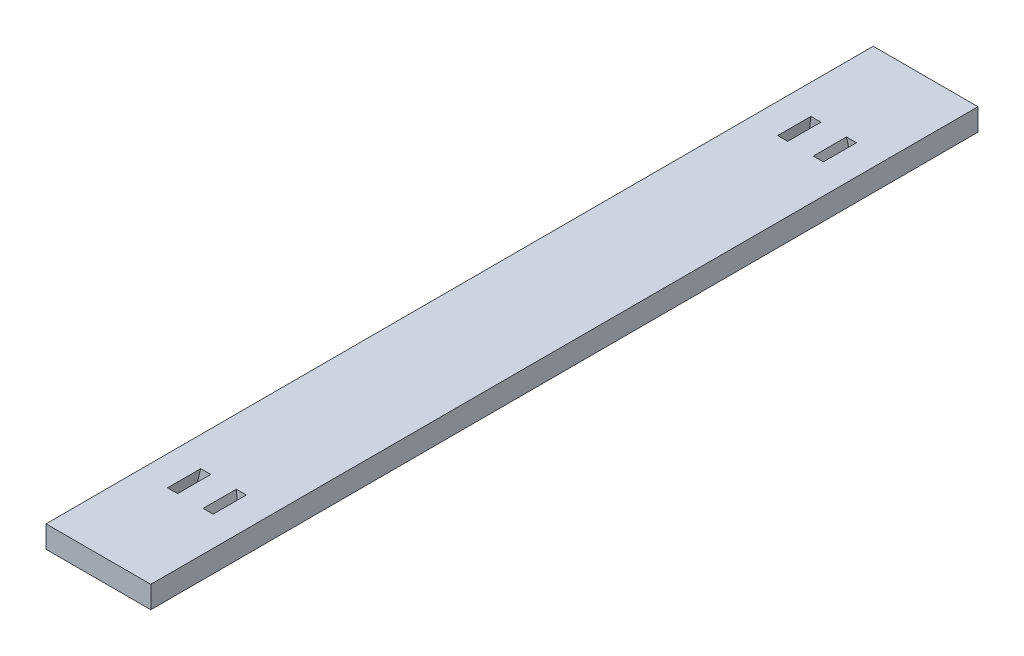
ISO-10303-21;
HEADER;
FILE_DESCRIPTION(('STEP AP214'),'2;1');
FILE_NAME('part.step','',(''),(''),'','','');
FILE_SCHEMA(('AUTOMOTIVE_DESIGN { 1 0 10303 214 1 1 1 1 }'));
ENDSEC;
DATA;
#1=APPLICATION_CONTEXT('core data for automotive mechanical design processes');
#2=APPLICATION_PROTOCOL_DEFINITION('international standard','automotive_design',2000,#1);
#3=PRODUCT_CONTEXT('',#1,'mechanical');
#4=PRODUCT('Part','Part','',(#3));
#5=PRODUCT_RELATED_PRODUCT_CATEGORY('part','',(#4));
#6=PRODUCT_DEFINITION_FORMATION('','',#4);
#7=PRODUCT_DEFINITION_CONTEXT('part definition',#1,'design');
#8=PRODUCT_DEFINITION('design','',#6,#7);
#9=PRODUCT_DEFINITION_SHAPE('','',#8);
#10=(LENGTH_UNIT() NAMED_UNIT(*) SI_UNIT(.MILLI.,.METRE.));
#11=(NAMED_UNIT(*) PLANE_ANGLE_UNIT() SI_UNIT($,.RADIAN.));
#12=(NAMED_UNIT(*) SI_UNIT($,.STERADIAN.) SOLID_ANGLE_UNIT());
#13=UNCERTAINTY_MEASURE_WITH_UNIT(LENGTH_MEASURE(1.E-05),#10,'distance_accuracy_value','');
#14=(GEOMETRIC_REPRESENTATION_CONTEXT(3) GLOBAL_UNCERTAINTY_ASSIGNED_CONTEXT((#13)) GLOBAL_UNIT_ASSIGNED_CONTEXT((#10,
#11,#12)) REPRESENTATION_CONTEXT('',''));
#15=CARTESIAN_POINT('',(0.,0.,0.));
#16=DIRECTION('',(0.,0.,1.));
#17=DIRECTION('',(1.,0.,0.));
#18=AXIS2_PLACEMENT_3D('',#15,#16,#17);
#19=CARTESIAN_POINT('',(0.,0.,-1500.));
#20=DIRECTION('',(0.,1.,0.));
#21=DIRECTION('',(0.,0.,1.));
#22=AXIS2_PLACEMENT_3D('',#19,#20,#21);
#23=PLANE('',#22);
#24=DIRECTION('',(-1.,0.,0.));
#25=VECTOR('',#24,1.);
#26=CARTESIAN_POINT('',(118.153345581463,0.,-1273.13111618982));
#27=LINE('',#26,#25);
#28=CARTESIAN_POINT('',(136.333345581463,0.,-1273.13111618982));
#29=VERTEX_POINT('',#28);
#30=CARTESIAN_POINT('',(118.153345581463,0.,-1273.13111618982));
#31=VERTEX_POINT('',#30);
#32=EDGE_CURVE('E217',#29,#31,#27,.T.);
#33=ORIENTED_EDGE('',*,*,#32,.T.);
#34=DIRECTION('',(0.,0.,-1.));
#35=VECTOR('',#34,1.);
#36=CARTESIAN_POINT('',(118.153345581463,0.,-1273.13111618982));
#37=LINE('',#36,#35);
#38=CARTESIAN_POINT('',(118.153345581463,0.,-1333.3));
#39=VERTEX_POINT('',#38);
#40=EDGE_CURVE('E208',#31,#39,#37,.T.);
#41=ORIENTED_EDGE('',*,*,#40,.T.);
#42=DIRECTION('',(1.,0.,0.));
#43=VECTOR('',#42,1.);
#44=CARTESIAN_POINT('',(118.153345581463,0.,-1333.3));
#45=LINE('',#44,#43);
#46=CARTESIAN_POINT('',(136.333345581463,0.,-1333.3));
#47=VERTEX_POINT('',#46);
#48=EDGE_CURVE('E223',#39,#47,#45,.T.);
#49=ORIENTED_EDGE('',*,*,#48,.T.);
#50=DIRECTION('',(0.,0.,1.));
#51=VECTOR('',#50,1.);
#52=CARTESIAN_POINT('',(136.333345581463,0.,-1273.13111618982));
#53=LINE('',#52,#51);
#54=EDGE_CURVE('E220',#47,#29,#53,.T.);
#55=ORIENTED_EDGE('',*,*,#54,.T.);
#56=EDGE_LOOP('',(#33,#41,#49,#55));
#57=FACE_BOUND('',#56,.T.);
#58=DIRECTION('',(0.,0.,1.));
#59=VECTOR('',#58,1.);
#60=CARTESIAN_POINT('',(118.153345581463,0.,-226.868883810179));
#61=LINE('',#60,#59);
#62=CARTESIAN_POINT('',(118.153345581463,0.,-226.868883810179));
#63=VERTEX_POINT('',#62);
#64=CARTESIAN_POINT('',(118.153345581463,0.,-166.7));
#65=VERTEX_POINT('',#64);
#66=EDGE_CURVE('E229',#63,#65,#61,.T.);
#67=ORIENTED_EDGE('',*,*,#66,.F.);
#68=DIRECTION('',(-1.,0.,0.));
#69=VECTOR('',#68,1.);
#70=CARTESIAN_POINT('',(118.153345581463,0.,-226.868883810179));
#71=LINE('',#70,#69);
#72=CARTESIAN_POINT('',(136.333345581463,0.,-226.868883810179));
#73=VERTEX_POINT('',#72);
#74=EDGE_CURVE('E243',#73,#63,#71,.T.);
#75=ORIENTED_EDGE('',*,*,#74,.F.);
#76=DIRECTION('',(0.,0.,-1.));
#77=VECTOR('',#76,1.);
#78=CARTESIAN_POINT('',(136.333345581463,0.,-226.868883810179));
#79=LINE('',#78,#77);
#80=CARTESIAN_POINT('',(136.333345581463,0.,-166.7));
#81=VERTEX_POINT('',#80);
#82=EDGE_CURVE('E240',#81,#73,#79,.T.);
#83=ORIENTED_EDGE('',*,*,#82,.F.);
#84=DIRECTION('',(1.,0.,0.));
#85=VECTOR('',#84,1.);
#86=CARTESIAN_POINT('',(118.153345581463,0.,-166.7));
#87=LINE('',#86,#85);
#88=EDGE_CURVE('E237',#65,#81,#87,.T.);
#89=ORIENTED_EDGE('',*,*,#88,.F.);
#90=EDGE_LOOP('',(#67,#75,#83,#89));
#91=FACE_BOUND('',#90,.T.);
#92=DIRECTION('',(-1.,0.,0.));
#93=VECTOR('',#92,1.);
#94=CARTESIAN_POINT('',(0.,0.,0.));
#95=LINE('',#94,#93);
#96=CARTESIAN_POINT('',(190.,0.,0.));
#97=VERTEX_POINT('',#96);
#98=CARTESIAN_POINT('',(0.,0.,0.));
#99=VERTEX_POINT('',#98);
#100=EDGE_CURVE('E260',#97,#99,#95,.T.);
#101=ORIENTED_EDGE('',*,*,#100,.F.);
#102=DIRECTION('',(0.,0.,1.));
#103=VECTOR('',#102,1.);
#104=CARTESIAN_POINT('',(190.,0.,-1500.));
#105=LINE('',#104,#103);
#106=CARTESIAN_POINT('',(190.,0.,-1500.));
#107=VERTEX_POINT('',#106);
#108=EDGE_CURVE('E283',#107,#97,#105,.T.);
#109=ORIENTED_EDGE('',*,*,#108,.F.);
#110=DIRECTION('',(-1.,0.,0.));
#111=VECTOR('',#110,1.);
#112=CARTESIAN_POINT('',(0.,0.,-1500.));
#113=LINE('',#112,#111);
#114=CARTESIAN_POINT('',(0.,0.,-1500.));
#115=VERTEX_POINT('',#114);
#116=EDGE_CURVE('E266',#107,#115,#113,.T.);
#117=ORIENTED_EDGE('',*,*,#116,.T.);
#118=DIRECTION('',(0.,0.,1.));
#119=VECTOR('',#118,1.);
#120=CARTESIAN_POINT('',(0.,0.,-1500.));
#121=LINE('',#120,#119);
#122=EDGE_CURVE('E280',#115,#99,#121,.T.);
#123=ORIENTED_EDGE('',*,*,#122,.T.);
#124=EDGE_LOOP('',(#101,#109,#117,#123));
#125=FACE_BOUND('',#124,.T.);
#126=DIRECTION('',(0.,0.,-1.));
#127=VECTOR('',#126,1.);
#128=CARTESIAN_POINT('',(71.8466544185373,0.,-1273.13111618982));
#129=LINE('',#128,#127);
#130=CARTESIAN_POINT('',(71.8466544185373,0.,-1273.13111618982));
#131=VERTEX_POINT('',#130);
#132=CARTESIAN_POINT('',(71.8466544185373,0.,-1333.3));
#133=VERTEX_POINT('',#132);
#134=EDGE_CURVE('E192',#131,#133,#129,.T.);
#135=ORIENTED_EDGE('',*,*,#134,.F.);
#136=DIRECTION('',(1.,0.,0.));
#137=VECTOR('',#136,1.);
#138=CARTESIAN_POINT('',(71.8466544185373,0.,-1273.13111618982));
#139=LINE('',#138,#137);
#140=CARTESIAN_POINT('',(53.6666544185373,0.,-1273.13111618982));
#141=VERTEX_POINT('',#140);
#142=EDGE_CURVE('E202',#141,#131,#139,.T.);
#143=ORIENTED_EDGE('',*,*,#142,.F.);
#144=DIRECTION('',(0.,0.,1.));
#145=VECTOR('',#144,1.);
#146=CARTESIAN_POINT('',(53.6666544185373,0.,-1273.13111618982));
#147=LINE('',#146,#145);
#148=CARTESIAN_POINT('',(53.6666544185373,0.,-1333.3));
#149=VERTEX_POINT('',#148);
#150=EDGE_CURVE('E199',#149,#141,#147,.T.);
#151=ORIENTED_EDGE('',*,*,#150,.F.);
#152=DIRECTION('',(-1.,0.,0.));
#153=VECTOR('',#152,1.);
#154=CARTESIAN_POINT('',(71.8466544185373,0.,-1333.3));
#155=LINE('',#154,#153);
#156=EDGE_CURVE('E196',#133,#149,#155,.T.);
#157=ORIENTED_EDGE('',*,*,#156,.F.);
#158=EDGE_LOOP('',(#135,#143,#151,#157));
#159=FACE_BOUND('',#158,.T.);
#160=DIRECTION('',(1.,0.,0.));
#161=VECTOR('',#160,1.);
#162=CARTESIAN_POINT('',(71.8466544185373,0.,-226.868883810179));
#163=LINE('',#162,#161);
#164=CARTESIAN_POINT('',(53.6666544185373,0.,-226.868883810179));
#165=VERTEX_POINT('',#164);
#166=CARTESIAN_POINT('',(71.8466544185373,0.,-226.868883810179));
#167=VERTEX_POINT('',#166);
#168=EDGE_CURVE('E180',#165,#167,#163,.T.);
#169=ORIENTED_EDGE('',*,*,#168,.T.);
#170=DIRECTION('',(0.,0.,1.));
#171=VECTOR('',#170,1.);
#172=CARTESIAN_POINT('',(71.8466544185373,0.,-226.868883810179));
#173=LINE('',#172,#171);
#174=CARTESIAN_POINT('',(71.8466544185373,0.,-166.7));
#175=VERTEX_POINT('',#174);
#176=EDGE_CURVE('E46',#167,#175,#173,.T.);
#177=ORIENTED_EDGE('',*,*,#176,.T.);
#178=DIRECTION('',(-1.,0.,0.));
#179=VECTOR('',#178,1.);
#180=CARTESIAN_POINT('',(71.8466544185373,0.,-166.7));
#181=LINE('',#180,#179);
#182=CARTESIAN_POINT('',(53.6666544185373,0.,-166.7));
#183=VERTEX_POINT('',#182);
#184=EDGE_CURVE('E185',#175,#183,#181,.T.);
#185=ORIENTED_EDGE('',*,*,#184,.T.);
#186=DIRECTION('',(0.,0.,-1.));
#187=VECTOR('',#186,1.);
#188=CARTESIAN_POINT('',(53.6666544185373,0.,-226.868883810179));
#189=LINE('',#188,#187);
#190=EDGE_CURVE('E171',#183,#165,#189,.T.);
#191=ORIENTED_EDGE('',*,*,#190,.T.);
#192=EDGE_LOOP('',(#169,#177,#185,#191));
#193=FACE_BOUND('',#192,.T.);
#194=ADVANCED_FACE('F31',(#57,#91,#125,#159,#193),#23,.T.);
#195=CARTESIAN_POINT('',(0.,-40.,-1500.));
#196=DIRECTION('',(0.,-1.,0.));
#197=DIRECTION('',(0.,0.,-1.));
#198=AXIS2_PLACEMENT_3D('',#195,#196,#197);
#199=PLANE('',#198);
#200=DIRECTION('',(-1.,0.,0.));
#201=VECTOR('',#200,1.);
#202=CARTESIAN_POINT('',(0.,-40.,-1336.30330033003));
#203=LINE('',#202,#201);
#204=CARTESIAN_POINT('',(143.88,-40.,-1336.30330033003));
#205=VERTEX_POINT('',#204);
#206=CARTESIAN_POINT('',(125.7,-39.9999999999999,-1336.30330033003));
#207=VERTEX_POINT('',#206);
#208=EDGE_CURVE('E302',#205,#207,#203,.T.);
#209=ORIENTED_EDGE('',*,*,#208,.T.);
#210=DIRECTION('',(0.,0.,1.));
#211=VECTOR('',#210,1.);
#212=CARTESIAN_POINT('',(125.7,-40.,-1500.));
#213=LINE('',#212,#211);
#214=CARTESIAN_POINT('',(125.7,-39.9999999999999,-1276.13441651985));
#215=VERTEX_POINT('',#214);
#216=EDGE_CURVE('E305',#207,#215,#213,.T.);
#217=ORIENTED_EDGE('',*,*,#216,.T.);
#218=DIRECTION('',(1.,0.,0.));
#219=VECTOR('',#218,1.);
#220=CARTESIAN_POINT('',(0.,-40.,-1276.13441651985));
#221=LINE('',#220,#219);
#222=CARTESIAN_POINT('',(143.88,-39.9999999999999,-1276.13441651985));
#223=VERTEX_POINT('',#222);
#224=EDGE_CURVE('E296',#215,#223,#221,.T.);
#225=ORIENTED_EDGE('',*,*,#224,.T.);
#226=DIRECTION('',(0.,0.,-1.));
#227=VECTOR('',#226,1.);
#228=CARTESIAN_POINT('',(143.88,-40.,-1500.));
#229=LINE('',#228,#227);
#230=EDGE_CURVE('E299',#223,#205,#229,.T.);
#231=ORIENTED_EDGE('',*,*,#230,.T.);
#232=EDGE_LOOP('',(#209,#217,#225,#231));
#233=FACE_BOUND('',#232,.T.);
#234=DIRECTION('',(0.,0.,-1.));
#235=VECTOR('',#234,1.);
#236=CARTESIAN_POINT('',(125.7,-40.,-1500.));
#237=LINE('',#236,#235);
#238=CARTESIAN_POINT('',(125.7,-39.9999999999999,-163.696699669967));
#239=VERTEX_POINT('',#238);
#240=CARTESIAN_POINT('',(125.7,-39.9999999999999,-223.865583480146));
#241=VERTEX_POINT('',#240);
#242=EDGE_CURVE('E294',#239,#241,#237,.T.);
#243=ORIENTED_EDGE('',*,*,#242,.F.);
#244=DIRECTION('',(-1.,0.,0.));
#245=VECTOR('',#244,1.);
#246=CARTESIAN_POINT('',(0.,-40.,-163.696699669967));
#247=LINE('',#246,#245);
#248=CARTESIAN_POINT('',(143.88,-39.9999999999999,-163.696699669967));
#249=VERTEX_POINT('',#248);
#250=EDGE_CURVE('E282',#249,#239,#247,.T.);
#251=ORIENTED_EDGE('',*,*,#250,.F.);
#252=DIRECTION('',(0.,0.,1.));
#253=VECTOR('',#252,1.);
#254=CARTESIAN_POINT('',(143.88,-40.,-1500.));
#255=LINE('',#254,#253);
#256=CARTESIAN_POINT('',(143.88,-40.,-223.865583480146));
#257=VERTEX_POINT('',#256);
#258=EDGE_CURVE('E289',#257,#249,#255,.T.);
#259=ORIENTED_EDGE('',*,*,#258,.F.);
#260=DIRECTION('',(1.,0.,0.));
#261=VECTOR('',#260,1.);
#262=CARTESIAN_POINT('',(0.,-40.,-223.865583480146));
#263=LINE('',#262,#261);
#264=EDGE_CURVE('E292',#241,#257,#263,.T.);
#265=ORIENTED_EDGE('',*,*,#264,.F.);
#266=EDGE_LOOP('',(#243,#251,#259,#265));
#267=FACE_BOUND('',#266,.T.);
#268=DIRECTION('',(1.,0.,0.));
#269=VECTOR('',#268,1.);
#270=CARTESIAN_POINT('',(0.,-40.,0.));
#271=LINE('',#270,#269);
#272=CARTESIAN_POINT('',(0.,-40.,0.));
#273=VERTEX_POINT('',#272);
#274=CARTESIAN_POINT('',(190.,-40.,0.));
#275=VERTEX_POINT('',#274);
#276=EDGE_CURVE('E272',#273,#275,#271,.T.);
#277=ORIENTED_EDGE('',*,*,#276,.F.);
#278=DIRECTION('',(0.,0.,1.));
#279=VECTOR('',#278,1.);
#280=CARTESIAN_POINT('',(0.,-40.,-1500.));
#281=LINE('',#280,#279);
#282=CARTESIAN_POINT('',(0.,-40.,-1500.));
#283=VERTEX_POINT('',#282);
#284=EDGE_CURVE('E269',#283,#273,#281,.T.);
#285=ORIENTED_EDGE('',*,*,#284,.F.);
#286=DIRECTION('',(1.,0.,0.));
#287=VECTOR('',#286,1.);
#288=CARTESIAN_POINT('',(0.,-40.,-1500.));
#289=LINE('',#288,#287);
#290=CARTESIAN_POINT('',(190.,-40.,-1500.));
#291=VERTEX_POINT('',#290);
#292=EDGE_CURVE('E259',#283,#291,#289,.T.);
#293=ORIENTED_EDGE('',*,*,#292,.T.);
#294=DIRECTION('',(0.,0.,1.));
#295=VECTOR('',#294,1.);
#296=CARTESIAN_POINT('',(190.,-40.,-1500.));
#297=LINE('',#296,#295);
#298=EDGE_CURVE('E285',#291,#275,#297,.T.);
#299=ORIENTED_EDGE('',*,*,#298,.T.);
#300=EDGE_LOOP('',(#277,#285,#293,#299));
#301=FACE_BOUND('',#300,.T.);
#302=DIRECTION('',(0.,0.,1.));
#303=VECTOR('',#302,1.);
#304=CARTESIAN_POINT('',(64.3,-40.,-1500.));
#305=LINE('',#304,#303);
#306=CARTESIAN_POINT('',(64.3000000000001,-39.9999999999999,-1336.30330033003));
#307=VERTEX_POINT('',#306);
#308=CARTESIAN_POINT('',(64.3000000000001,-39.9999999999999,-1276.13441651985));
#309=VERTEX_POINT('',#308);
#310=EDGE_CURVE('E315',#307,#309,#305,.T.);
#311=ORIENTED_EDGE('',*,*,#310,.F.);
#312=DIRECTION('',(1.,0.,0.));
#313=VECTOR('',#312,1.);
#314=CARTESIAN_POINT('',(0.,-40.,-1336.30330033003));
#315=LINE('',#314,#313);
#316=CARTESIAN_POINT('',(46.12,-39.9999999999999,-1336.30330033003));
#317=VERTEX_POINT('',#316);
#318=EDGE_CURVE('E308',#317,#307,#315,.T.);
#319=ORIENTED_EDGE('',*,*,#318,.F.);
#320=DIRECTION('',(0.,0.,-1.));
#321=VECTOR('',#320,1.);
#322=CARTESIAN_POINT('',(46.12,-40.,-1500.));
#323=LINE('',#322,#321);
#324=CARTESIAN_POINT('',(46.12,-40.,-1276.13441651985));
#325=VERTEX_POINT('',#324);
#326=EDGE_CURVE('E310',#325,#317,#323,.T.);
#327=ORIENTED_EDGE('',*,*,#326,.F.);
#328=DIRECTION('',(-1.,0.,0.));
#329=VECTOR('',#328,1.);
#330=CARTESIAN_POINT('',(0.,-40.,-1276.13441651985));
#331=LINE('',#330,#329);
#332=EDGE_CURVE('E313',#309,#325,#331,.T.);
#333=ORIENTED_EDGE('',*,*,#332,.F.);
#334=EDGE_LOOP('',(#311,#319,#327,#333));
#335=FACE_BOUND('',#334,.T.);
#336=DIRECTION('',(1.,0.,0.));
#337=VECTOR('',#336,1.);
#338=CARTESIAN_POINT('',(0.,-40.,-163.696699669967));
#339=LINE('',#338,#337);
#340=CARTESIAN_POINT('',(46.12,-40.,-163.696699669967));
#341=VERTEX_POINT('',#340);
#342=CARTESIAN_POINT('',(64.3000000000001,-39.9999999999999,-163.696699669967));
#343=VERTEX_POINT('',#342);
#344=EDGE_CURVE('E39',#341,#343,#339,.T.);
#345=ORIENTED_EDGE('',*,*,#344,.T.);
#346=DIRECTION('',(0.,0.,-1.));
#347=VECTOR('',#346,1.);
#348=CARTESIAN_POINT('',(64.3,-40.,-1500.));
#349=LINE('',#348,#347);
#350=CARTESIAN_POINT('',(64.3000000000001,-39.9999999999999,-223.865583480146));
#351=VERTEX_POINT('',#350);
#352=EDGE_CURVE('E11',#343,#351,#349,.T.);
#353=ORIENTED_EDGE('',*,*,#352,.T.);
#354=DIRECTION('',(-1.,0.,0.));
#355=VECTOR('',#354,1.);
#356=CARTESIAN_POINT('',(0.,-40.,-223.865583480146));
#357=LINE('',#356,#355);
#358=CARTESIAN_POINT('',(46.12,-39.9999999999999,-223.865583480146));
#359=VERTEX_POINT('',#358);
#360=EDGE_CURVE('E317',#351,#359,#357,.T.);
#361=ORIENTED_EDGE('',*,*,#360,.T.);
#362=DIRECTION('',(0.,0.,1.));
#363=VECTOR('',#362,1.);
#364=CARTESIAN_POINT('',(46.12,-40.,-1500.));
#365=LINE('',#364,#363);
#366=EDGE_CURVE('E174',#359,#341,#365,.T.);
#367=ORIENTED_EDGE('',*,*,#366,.T.);
#368=EDGE_LOOP('',(#345,#353,#361,#367));
#369=FACE_BOUND('',#368,.T.);
#370=ADVANCED_FACE('F321',(#233,#267,#301,#335,#369),#199,.T.);
#371=CARTESIAN_POINT('',(0.,0.,-1500.));
#372=DIRECTION('',(-1.,0.,0.));
#373=DIRECTION('',(0.,0.,1.));
#374=AXIS2_PLACEMENT_3D('',#371,#372,#373);
#375=PLANE('',#374);
#376=DIRECTION('',(0.,-1.,0.));
#377=VECTOR('',#376,1.);
#378=CARTESIAN_POINT('',(0.,0.,0.));
#379=LINE('',#378,#377);
#380=EDGE_CURVE('E249',#99,#273,#379,.T.);
#381=ORIENTED_EDGE('',*,*,#380,.F.);
#382=ORIENTED_EDGE('',*,*,#122,.F.);
#383=DIRECTION('',(0.,-1.,0.));
#384=VECTOR('',#383,1.);
#385=CARTESIAN_POINT('',(0.,0.,-1500.));
#386=LINE('',#385,#384);
#387=EDGE_CURVE('E256',#115,#283,#386,.T.);
#388=ORIENTED_EDGE('',*,*,#387,.T.);
#389=ORIENTED_EDGE('',*,*,#284,.T.);
#390=EDGE_LOOP('',(#381,#382,#388,#389));
#391=FACE_BOUND('',#390,.T.);
#392=ADVANCED_FACE('F33',(#391),#375,.T.);
#393=CARTESIAN_POINT('',(190.,0.,-1500.));
#394=DIRECTION('',(1.,0.,0.));
#395=DIRECTION('',(0.,0.,-1.));
#396=AXIS2_PLACEMENT_3D('',#393,#394,#395);
#397=PLANE('',#396);
#398=DIRECTION('',(0.,1.,0.));
#399=VECTOR('',#398,1.);
#400=CARTESIAN_POINT('',(190.,0.,0.));
#401=LINE('',#400,#399);
#402=EDGE_CURVE('E275',#275,#97,#401,.T.);
#403=ORIENTED_EDGE('',*,*,#402,.F.);
#404=ORIENTED_EDGE('',*,*,#298,.F.);
#405=DIRECTION('',(0.,1.,0.));
#406=VECTOR('',#405,1.);
#407=CARTESIAN_POINT('',(190.,0.,-1500.));
#408=LINE('',#407,#406);
#409=EDGE_CURVE('E263',#291,#107,#408,.T.);
#410=ORIENTED_EDGE('',*,*,#409,.T.);
#411=ORIENTED_EDGE('',*,*,#108,.T.);
#412=EDGE_LOOP('',(#403,#404,#410,#411));
#413=FACE_BOUND('',#412,.T.);
#414=ADVANCED_FACE('F352',(#413),#397,.T.);
#415=CARTESIAN_POINT('',(0.,-40.,-1500.));
#416=DIRECTION('',(0.,0.,1.));
#417=DIRECTION('',(1.,0.,0.));
#418=AXIS2_PLACEMENT_3D('',#415,#416,#417);
#419=PLANE('',#418);
#420=ORIENTED_EDGE('',*,*,#387,.F.);
#421=ORIENTED_EDGE('',*,*,#116,.F.);
#422=ORIENTED_EDGE('',*,*,#409,.F.);
#423=ORIENTED_EDGE('',*,*,#292,.F.);
#424=EDGE_LOOP('',(#420,#421,#422,#423));
#425=FACE_BOUND('',#424,.T.);
#426=ADVANCED_FACE('F354',(#425),#419,.F.);
#427=CARTESIAN_POINT('',(0.,-40.,0.));
#428=DIRECTION('',(0.,0.,1.));
#429=DIRECTION('',(1.,0.,0.));
#430=AXIS2_PLACEMENT_3D('',#427,#428,#429);
#431=PLANE('',#430);
#432=ORIENTED_EDGE('',*,*,#380,.T.);
#433=ORIENTED_EDGE('',*,*,#276,.T.);
#434=ORIENTED_EDGE('',*,*,#402,.T.);
#435=ORIENTED_EDGE('',*,*,#100,.T.);
#436=EDGE_LOOP('',(#432,#433,#434,#435));
#437=FACE_BOUND('',#436,.T.);
#438=ADVANCED_FACE('F350',(#437),#431,.T.);
#439=CARTESIAN_POINT('',(395.492954200113,-1470.00031132951,-116.497573306072));
#440=DIRECTION('',(-0.98266396050203,-0.1853956329865,0.));
#441=DIRECTION('',(0.1853956329865,-0.98266396050203,0.));
#442=AXIS2_PLACEMENT_3D('',#439,#440,#441);
#443=PLANE('',#442);
#444=ORIENTED_EDGE('',*,*,#242,.T.);
#445=DIRECTION('',(-0.184893072412434,0.980000207553007,-0.0735808736694045));
#446=VECTOR('',#445,1.);
#447=CARTESIAN_POINT('',(395.492954200113,-1470.00031132951,-116.497573306072));
#448=LINE('',#447,#446);
#449=EDGE_CURVE('E247',#241,#63,#448,.T.);
#450=ORIENTED_EDGE('',*,*,#449,.T.);
#451=ORIENTED_EDGE('',*,*,#66,.T.);
#452=DIRECTION('',(-0.184893072412434,0.980000207553007,-0.0735808736694045));
#453=VECTOR('',#452,1.);
#454=CARTESIAN_POINT('',(395.492954200113,-1470.00031132951,-56.3286894958932));
#455=LINE('',#454,#453);
#456=EDGE_CURVE('E246',#239,#65,#455,.T.);
#457=ORIENTED_EDGE('',*,*,#456,.F.);
#458=EDGE_LOOP('',(#444,#450,#451,#457));
#459=FACE_BOUND('',#458,.T.);
#460=ADVANCED_FACE('F420',(#459),#443,.F.);
#461=CARTESIAN_POINT('',(395.492954200113,-1470.00031132951,-116.497573306072));
#462=DIRECTION('',(0.,-0.0748717644366056,-0.997193170298588));
#463=DIRECTION('',(0.,0.997193170298588,-0.0748717644366056));
#464=AXIS2_PLACEMENT_3D('',#461,#462,#463);
#465=PLANE('',#464);
#466=ORIENTED_EDGE('',*,*,#264,.T.);
#467=DIRECTION('',(-0.184893072412434,0.980000207553007,-0.0735808736694045));
#468=VECTOR('',#467,1.);
#469=CARTESIAN_POINT('',(413.672954200113,-1470.00031132951,-116.497573306072));
#470=LINE('',#469,#468);
#471=EDGE_CURVE('E250',#257,#73,#470,.T.);
#472=ORIENTED_EDGE('',*,*,#471,.T.);
#473=ORIENTED_EDGE('',*,*,#74,.T.);
#474=ORIENTED_EDGE('',*,*,#449,.F.);
#475=EDGE_LOOP('',(#466,#472,#473,#474));
#476=FACE_BOUND('',#475,.T.);
#477=ADVANCED_FACE('F416',(#476),#465,.F.);
#478=CARTESIAN_POINT('',(413.672954200113,-1470.00031132951,-116.497573306072));
#479=DIRECTION('',(0.98266396050203,0.1853956329865,0.));
#480=DIRECTION('',(-0.1853956329865,0.98266396050203,0.));
#481=AXIS2_PLACEMENT_3D('',#478,#479,#480);
#482=PLANE('',#481);
#483=ORIENTED_EDGE('',*,*,#258,.T.);
#484=DIRECTION('',(-0.184893072412434,0.980000207553007,-0.0735808736694045));
#485=VECTOR('',#484,1.);
#486=CARTESIAN_POINT('',(413.672954200113,-1470.00031132951,-56.3286894958932));
#487=LINE('',#486,#485);
#488=EDGE_CURVE('E252',#249,#81,#487,.T.);
#489=ORIENTED_EDGE('',*,*,#488,.T.);
#490=ORIENTED_EDGE('',*,*,#82,.T.);
#491=ORIENTED_EDGE('',*,*,#471,.F.);
#492=EDGE_LOOP('',(#483,#489,#490,#491));
#493=FACE_BOUND('',#492,.T.);
#494=ADVANCED_FACE('F419',(#493),#482,.F.);
#495=CARTESIAN_POINT('',(395.492954200113,-1470.00031132951,-56.3286894958932));
#496=DIRECTION('',(0.,0.0748717644366056,0.997193170298588));
#497=DIRECTION('',(0.,-0.997193170298588,0.0748717644366056));
#498=AXIS2_PLACEMENT_3D('',#495,#496,#497);
#499=PLANE('',#498);
#500=ORIENTED_EDGE('',*,*,#250,.T.);
#501=ORIENTED_EDGE('',*,*,#456,.T.);
#502=ORIENTED_EDGE('',*,*,#88,.T.);
#503=ORIENTED_EDGE('',*,*,#488,.F.);
#504=EDGE_LOOP('',(#500,#501,#502,#503));
#505=FACE_BOUND('',#504,.T.);
#506=ADVANCED_FACE('F414',(#505),#499,.F.);
#507=CARTESIAN_POINT('',(395.492954200113,-1470.00031132951,-1383.50242669393));
#508=DIRECTION('',(0.98266396050203,0.1853956329865,0.));
#509=DIRECTION('',(-0.1853956329865,0.98266396050203,0.));
#510=AXIS2_PLACEMENT_3D('',#507,#508,#509);
#511=PLANE('',#510);
#512=DIRECTION('',(-0.184893072412434,0.980000207553007,0.0735808736694045));
#513=VECTOR('',#512,1.);
#514=CARTESIAN_POINT('',(395.492954200113,-1470.00031132951,-1443.67131050411));
#515=LINE('',#514,#513);
#516=EDGE_CURVE('E227',#207,#39,#515,.T.);
#517=ORIENTED_EDGE('',*,*,#516,.T.);
#518=ORIENTED_EDGE('',*,*,#40,.F.);
#519=DIRECTION('',(-0.184893072412434,0.980000207553007,0.0735808736694045));
#520=VECTOR('',#519,1.);
#521=CARTESIAN_POINT('',(395.492954200113,-1470.00031132951,-1383.50242669393));
#522=LINE('',#521,#520);
#523=EDGE_CURVE('E226',#215,#31,#522,.T.);
#524=ORIENTED_EDGE('',*,*,#523,.F.);
#525=ORIENTED_EDGE('',*,*,#216,.F.);
#526=EDGE_LOOP('',(#517,#518,#524,#525));
#527=FACE_BOUND('',#526,.T.);
#528=ADVANCED_FACE('F404',(#527),#511,.T.);
#529=CARTESIAN_POINT('',(395.492954200113,-1470.00031132951,-1443.67131050411));
#530=DIRECTION('',(0.,-0.0748717644366056,0.997193170298588));
#531=DIRECTION('',(0.,-0.997193170298588,-0.0748717644366056));
#532=AXIS2_PLACEMENT_3D('',#529,#530,#531);
#533=PLANE('',#532);
#534=DIRECTION('',(-0.184893072412434,0.980000207553007,0.0735808736694045));
#535=VECTOR('',#534,1.);
#536=CARTESIAN_POINT('',(413.672954200113,-1470.00031132951,-1443.67131050411));
#537=LINE('',#536,#535);
#538=EDGE_CURVE('E230',#205,#47,#537,.T.);
#539=ORIENTED_EDGE('',*,*,#538,.T.);
#540=ORIENTED_EDGE('',*,*,#48,.F.);
#541=ORIENTED_EDGE('',*,*,#516,.F.);
#542=ORIENTED_EDGE('',*,*,#208,.F.);
#543=EDGE_LOOP('',(#539,#540,#541,#542));
#544=FACE_BOUND('',#543,.T.);
#545=ADVANCED_FACE('F400',(#544),#533,.T.);
#546=CARTESIAN_POINT('',(413.672954200113,-1470.00031132951,-1383.50242669393));
#547=DIRECTION('',(-0.98266396050203,-0.1853956329865,0.));
#548=DIRECTION('',(0.1853956329865,-0.98266396050203,0.));
#549=AXIS2_PLACEMENT_3D('',#546,#547,#548);
#550=PLANE('',#549);
#551=DIRECTION('',(-0.184893072412434,0.980000207553007,0.0735808736694045));
#552=VECTOR('',#551,1.);
#553=CARTESIAN_POINT('',(413.672954200113,-1470.00031132951,-1383.50242669393));
#554=LINE('',#553,#552);
#555=EDGE_CURVE('E232',#223,#29,#554,.T.);
#556=ORIENTED_EDGE('',*,*,#555,.T.);
#557=ORIENTED_EDGE('',*,*,#54,.F.);
#558=ORIENTED_EDGE('',*,*,#538,.F.);
#559=ORIENTED_EDGE('',*,*,#230,.F.);
#560=EDGE_LOOP('',(#556,#557,#558,#559));
#561=FACE_BOUND('',#560,.T.);
#562=ADVANCED_FACE('F403',(#561),#550,.T.);
#563=CARTESIAN_POINT('',(395.492954200113,-1470.00031132951,-1383.50242669393));
#564=DIRECTION('',(0.,0.0748717644366056,-0.997193170298588));
#565=DIRECTION('',(0.,0.997193170298588,0.0748717644366056));
#566=AXIS2_PLACEMENT_3D('',#563,#564,#565);
#567=PLANE('',#566);
#568=ORIENTED_EDGE('',*,*,#523,.T.);
#569=ORIENTED_EDGE('',*,*,#32,.F.);
#570=ORIENTED_EDGE('',*,*,#555,.F.);
#571=ORIENTED_EDGE('',*,*,#224,.F.);
#572=EDGE_LOOP('',(#568,#569,#570,#571));
#573=FACE_BOUND('',#572,.T.);
#574=ADVANCED_FACE('F399',(#573),#567,.T.);
#575=CARTESIAN_POINT('',(-205.492954200113,-1470.00031132951,-1383.50242669393));
#576=DIRECTION('',(0.98266396050203,-0.1853956329865,0.));
#577=DIRECTION('',(0.1853956329865,0.98266396050203,0.));
#578=AXIS2_PLACEMENT_3D('',#575,#576,#577);
#579=PLANE('',#578);
#580=ORIENTED_EDGE('',*,*,#310,.T.);
#581=DIRECTION('',(0.184893072412434,0.980000207553007,0.0735808736694045));
#582=VECTOR('',#581,1.);
#583=CARTESIAN_POINT('',(-205.492954200113,-1470.00031132951,-1383.50242669393));
#584=LINE('',#583,#582);
#585=EDGE_CURVE('E206',#309,#131,#584,.T.);
#586=ORIENTED_EDGE('',*,*,#585,.T.);
#587=ORIENTED_EDGE('',*,*,#134,.T.);
#588=DIRECTION('',(0.184893072412434,0.980000207553007,0.0735808736694045));
#589=VECTOR('',#588,1.);
#590=CARTESIAN_POINT('',(-205.492954200113,-1470.00031132951,-1443.67131050411));
#591=LINE('',#590,#589);
#592=EDGE_CURVE('E205',#307,#133,#591,.T.);
#593=ORIENTED_EDGE('',*,*,#592,.F.);
#594=EDGE_LOOP('',(#580,#586,#587,#593));
#595=FACE_BOUND('',#594,.T.);
#596=ADVANCED_FACE('F381',(#595),#579,.F.);
#597=CARTESIAN_POINT('',(-205.492954200113,-1470.00031132951,-1383.50242669393));
#598=DIRECTION('',(0.,-0.0748717644366056,0.997193170298588));
#599=DIRECTION('',(0.,-0.997193170298588,-0.0748717644366056));
#600=AXIS2_PLACEMENT_3D('',#597,#598,#599);
#601=PLANE('',#600);
#602=ORIENTED_EDGE('',*,*,#332,.T.);
#603=DIRECTION('',(0.184893072412434,0.980000207553007,0.0735808736694045));
#604=VECTOR('',#603,1.);
#605=CARTESIAN_POINT('',(-223.672954200113,-1470.00031132951,-1383.50242669393));
#606=LINE('',#605,#604);
#607=EDGE_CURVE('E209',#325,#141,#606,.T.);
#608=ORIENTED_EDGE('',*,*,#607,.T.);
#609=ORIENTED_EDGE('',*,*,#142,.T.);
#610=ORIENTED_EDGE('',*,*,#585,.F.);
#611=EDGE_LOOP('',(#602,#608,#609,#610));
#612=FACE_BOUND('',#611,.T.);
#613=ADVANCED_FACE('F388',(#612),#601,.F.);
#614=CARTESIAN_POINT('',(-223.672954200113,-1470.00031132951,-1383.50242669393));
#615=DIRECTION('',(-0.98266396050203,0.1853956329865,0.));
#616=DIRECTION('',(-0.1853956329865,-0.98266396050203,0.));
#617=AXIS2_PLACEMENT_3D('',#614,#615,#616);
#618=PLANE('',#617);
#619=ORIENTED_EDGE('',*,*,#326,.T.);
#620=DIRECTION('',(0.184893072412434,0.980000207553007,0.0735808736694045));
#621=VECTOR('',#620,1.);
#622=CARTESIAN_POINT('',(-223.672954200113,-1470.00031132951,-1443.67131050411));
#623=LINE('',#622,#621);
#624=EDGE_CURVE('E211',#317,#149,#623,.T.);
#625=ORIENTED_EDGE('',*,*,#624,.T.);
#626=ORIENTED_EDGE('',*,*,#150,.T.);
#627=ORIENTED_EDGE('',*,*,#607,.F.);
#628=EDGE_LOOP('',(#619,#625,#626,#627));
#629=FACE_BOUND('',#628,.T.);
#630=ADVANCED_FACE('F334',(#629),#618,.F.);
#631=CARTESIAN_POINT('',(-205.492954200113,-1470.00031132951,-1443.67131050411));
#632=DIRECTION('',(0.,0.0748717644366056,-0.997193170298588));
#633=DIRECTION('',(0.,0.997193170298588,0.0748717644366056));
#634=AXIS2_PLACEMENT_3D('',#631,#632,#633);
#635=PLANE('',#634);
#636=ORIENTED_EDGE('',*,*,#318,.T.);
#637=ORIENTED_EDGE('',*,*,#592,.T.);
#638=ORIENTED_EDGE('',*,*,#156,.T.);
#639=ORIENTED_EDGE('',*,*,#624,.F.);
#640=EDGE_LOOP('',(#636,#637,#638,#639));
#641=FACE_BOUND('',#640,.T.);
#642=ADVANCED_FACE('F327',(#641),#635,.F.);
#643=CARTESIAN_POINT('',(-205.492954200113,-1470.00031132951,-116.497573306072));
#644=DIRECTION('',(-0.98266396050203,0.1853956329865,0.));
#645=DIRECTION('',(-0.1853956329865,-0.98266396050203,0.));
#646=AXIS2_PLACEMENT_3D('',#643,#644,#645);
#647=PLANE('',#646);
#648=DIRECTION('',(0.184893072412434,0.980000207553007,-0.0735808736694045));
#649=VECTOR('',#648,1.);
#650=CARTESIAN_POINT('',(-205.492954200113,-1470.00031132951,-56.3286894958932));
#651=LINE('',#650,#649);
#652=EDGE_CURVE('E190',#343,#175,#651,.T.);
#653=ORIENTED_EDGE('',*,*,#652,.T.);
#654=ORIENTED_EDGE('',*,*,#176,.F.);
#655=DIRECTION('',(0.184893072412434,0.980000207553007,-0.0735808736694045));
#656=VECTOR('',#655,1.);
#657=CARTESIAN_POINT('',(-205.492954200113,-1470.00031132951,-116.497573306072));
#658=LINE('',#657,#656);
#659=EDGE_CURVE('E177',#351,#167,#658,.T.);
#660=ORIENTED_EDGE('',*,*,#659,.F.);
#661=ORIENTED_EDGE('',*,*,#352,.F.);
#662=EDGE_LOOP('',(#653,#654,#660,#661));
#663=FACE_BOUND('',#662,.T.);
#664=ADVANCED_FACE('F325',(#663),#647,.T.);
#665=CARTESIAN_POINT('',(-205.492954200113,-1470.00031132951,-56.3286894958932));
#666=DIRECTION('',(0.,-0.0748717644366056,-0.997193170298588));
#667=DIRECTION('',(0.,0.997193170298588,-0.0748717644366056));
#668=AXIS2_PLACEMENT_3D('',#665,#666,#667);
#669=PLANE('',#668);
#670=DIRECTION('',(0.184893072412434,0.980000207553007,-0.0735808736694045));
#671=VECTOR('',#670,1.);
#672=CARTESIAN_POINT('',(-223.672954200113,-1470.00031132951,-56.3286894958932));
#673=LINE('',#672,#671);
#674=EDGE_CURVE('E176',#341,#183,#673,.T.);
#675=ORIENTED_EDGE('',*,*,#674,.T.);
#676=ORIENTED_EDGE('',*,*,#184,.F.);
#677=ORIENTED_EDGE('',*,*,#652,.F.);
#678=ORIENTED_EDGE('',*,*,#344,.F.);
#679=EDGE_LOOP('',(#675,#676,#677,#678));
#680=FACE_BOUND('',#679,.T.);
#681=ADVANCED_FACE('F324',(#680),#669,.T.);
#682=CARTESIAN_POINT('',(-223.672954200113,-1470.00031132951,-116.497573306072));
#683=DIRECTION('',(0.98266396050203,-0.1853956329865,0.));
#684=DIRECTION('',(0.1853956329865,0.98266396050203,0.));
#685=AXIS2_PLACEMENT_3D('',#682,#683,#684);
#686=PLANE('',#685);
#687=DIRECTION('',(0.184893072412434,0.980000207553007,-0.0735808736694045));
#688=VECTOR('',#687,1.);
#689=CARTESIAN_POINT('',(-223.672954200113,-1470.00031132951,-116.497573306072));
#690=LINE('',#689,#688);
#691=EDGE_CURVE('E54',#359,#165,#690,.T.);
#692=ORIENTED_EDGE('',*,*,#691,.T.);
#693=ORIENTED_EDGE('',*,*,#190,.F.);
#694=ORIENTED_EDGE('',*,*,#674,.F.);
#695=ORIENTED_EDGE('',*,*,#366,.F.);
#696=EDGE_LOOP('',(#692,#693,#694,#695));
#697=FACE_BOUND('',#696,.T.);
#698=ADVANCED_FACE('F168',(#697),#686,.T.);
#699=CARTESIAN_POINT('',(-205.492954200113,-1470.00031132951,-116.497573306072));
#700=DIRECTION('',(0.,0.0748717644366056,0.997193170298588));
#701=DIRECTION('',(0.,-0.997193170298588,0.0748717644366056));
#702=AXIS2_PLACEMENT_3D('',#699,#700,#701);
#703=PLANE('',#702);
#704=ORIENTED_EDGE('',*,*,#659,.T.);
#705=ORIENTED_EDGE('',*,*,#168,.F.);
#706=ORIENTED_EDGE('',*,*,#691,.F.);
#707=ORIENTED_EDGE('',*,*,#360,.F.);
#708=EDGE_LOOP('',(#704,#705,#706,#707));
#709=FACE_BOUND('',#708,.T.);
#710=ADVANCED_FACE('F181',(#709),#703,.T.);
#711=CLOSED_SHELL('',(#194,#370,#392,#414,#426,#438,#460,#477,#494,#506,#528,#545,#562,#574,
#596,#613,#630,#642,#664,#681,#698,#710));
#712=MANIFOLD_SOLID_BREP('B2',#711);
#713=ADVANCED_BREP_SHAPE_REPRESENTATION('',(#18,#712),#14);
#714=SHAPE_DEFINITION_REPRESENTATION(#9,#713);
ENDSEC;
END-ISO-10303-21;
